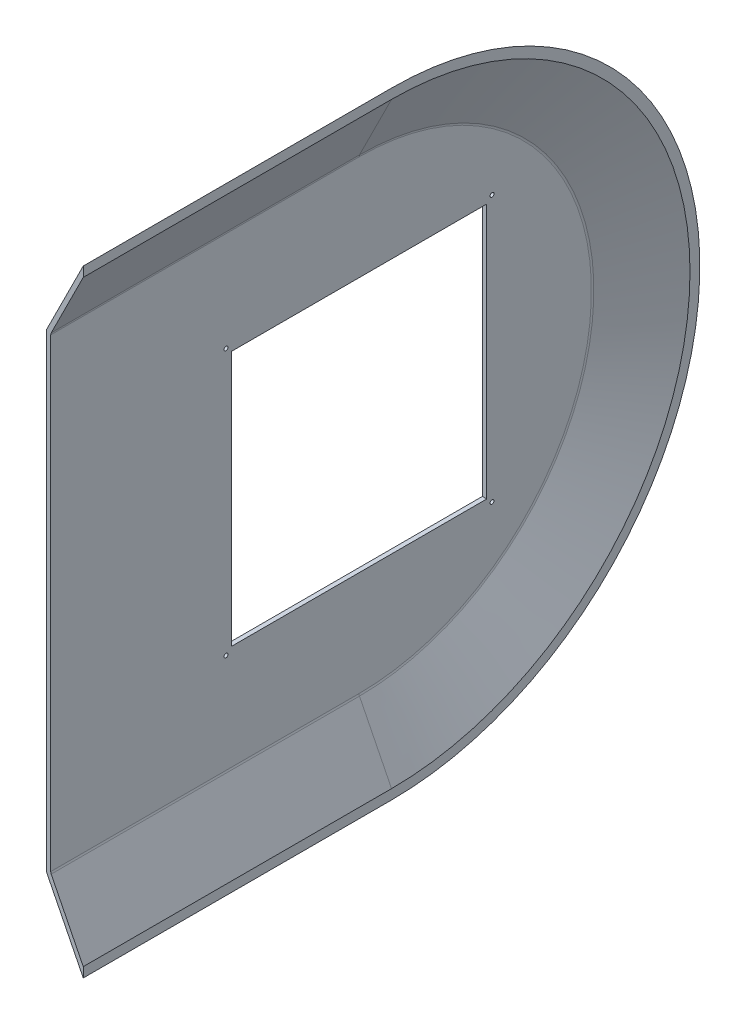
ISO-10303-21;
HEADER;
FILE_DESCRIPTION(('STEP AP214'),'2;1');
FILE_NAME('part.step','',(''),(''),'','','');
FILE_SCHEMA(('AUTOMOTIVE_DESIGN { 1 0 10303 214 1 1 1 1 }'));
ENDSEC;
DATA;
#1=APPLICATION_CONTEXT('core data for automotive mechanical design processes');
#2=APPLICATION_PROTOCOL_DEFINITION('international standard','automotive_design',2000,#1);
#3=PRODUCT_CONTEXT('',#1,'mechanical');
#4=PRODUCT('Part','Part','',(#3));
#5=PRODUCT_RELATED_PRODUCT_CATEGORY('part','',(#4));
#6=PRODUCT_DEFINITION_FORMATION('','',#4);
#7=PRODUCT_DEFINITION_CONTEXT('part definition',#1,'design');
#8=PRODUCT_DEFINITION('design','',#6,#7);
#9=PRODUCT_DEFINITION_SHAPE('','',#8);
#10=(LENGTH_UNIT() NAMED_UNIT(*) SI_UNIT(.MILLI.,.METRE.));
#11=(NAMED_UNIT(*) PLANE_ANGLE_UNIT() SI_UNIT($,.RADIAN.));
#12=(NAMED_UNIT(*) SI_UNIT($,.STERADIAN.) SOLID_ANGLE_UNIT());
#13=UNCERTAINTY_MEASURE_WITH_UNIT(LENGTH_MEASURE(1.E-05),#10,'distance_accuracy_value','');
#14=(GEOMETRIC_REPRESENTATION_CONTEXT(3) GLOBAL_UNCERTAINTY_ASSIGNED_CONTEXT((#13)) GLOBAL_UNIT_ASSIGNED_CONTEXT((#10,
#11,#12)) REPRESENTATION_CONTEXT('',''));
#15=CARTESIAN_POINT('',(0.,0.,0.));
#16=DIRECTION('',(0.,0.,1.));
#17=DIRECTION('',(1.,0.,0.));
#18=AXIS2_PLACEMENT_3D('',#15,#16,#17);
#19=CARTESIAN_POINT('',(41.9267587966222,-350.,2.44403693719019E-12));
#20=DIRECTION('',(1.,0.,0.));
#21=DIRECTION('',(0.,0.,-1.));
#22=AXIS2_PLACEMENT_3D('',#19,#20,#21);
#23=PLANE('',#22);
#24=DIRECTION('',(0.,1.,0.));
#25=VECTOR('',#24,1.);
#26=CARTESIAN_POINT('',(41.9267587966222,-350.,350.));
#27=LINE('',#26,#25);
#28=CARTESIAN_POINT('',(41.9267587966222,338.824360039982,350.));
#29=VERTEX_POINT('',#28);
#30=CARTESIAN_POINT('',(41.9267587966222,350.,350.));
#31=VERTEX_POINT('',#30);
#32=EDGE_CURVE('E241',#29,#31,#27,.T.);
#33=ORIENTED_EDGE('',*,*,#32,.F.);
#34=DIRECTION('',(0.,0.,-1.));
#35=VECTOR('',#34,1.);
#36=CARTESIAN_POINT('',(41.9267587966222,338.824360039982,350.));
#37=LINE('',#36,#35);
#38=CARTESIAN_POINT('',(41.9267587966222,338.824360039982,1.11022302462516E-13));
#39=VERTEX_POINT('',#38);
#40=EDGE_CURVE('E224',#29,#39,#37,.T.);
#41=ORIENTED_EDGE('',*,*,#40,.T.);
#42=CARTESIAN_POINT('',(41.9267587966222,0.,0.));
#43=DIRECTION('',(1.,0.,0.));
#44=DIRECTION('',(0.,0.,-1.));
#45=AXIS2_PLACEMENT_3D('',#42,#43,#44);
#46=CIRCLE('',#45,338.824360039982);
#47=CARTESIAN_POINT('',(41.9267587966222,-338.824360039982,2.46973290244916E-12));
#48=VERTEX_POINT('',#47);
#49=EDGE_CURVE('E220',#48,#39,#46,.T.);
#50=ORIENTED_EDGE('',*,*,#49,.F.);
#51=DIRECTION('',(0.,0.,-1.));
#52=VECTOR('',#51,1.);
#53=CARTESIAN_POINT('',(41.9267587966222,-338.824360039982,350.));
#54=LINE('',#53,#52);
#55=CARTESIAN_POINT('',(41.9267587966222,-338.824360039982,350.));
#56=VERTEX_POINT('',#55);
#57=EDGE_CURVE('E216',#56,#48,#54,.T.);
#58=ORIENTED_EDGE('',*,*,#57,.F.);
#59=CARTESIAN_POINT('',(41.9267587966222,-350.,350.));
#60=VERTEX_POINT('',#59);
#61=EDGE_CURVE('E242',#60,#56,#27,.T.);
#62=ORIENTED_EDGE('',*,*,#61,.F.);
#63=DIRECTION('',(0.,0.,-1.));
#64=VECTOR('',#63,1.);
#65=CARTESIAN_POINT('',(41.9267587966222,-350.,350.));
#66=LINE('',#65,#64);
#67=CARTESIAN_POINT('',(41.9267587966222,-350.,2.44403693719019E-12));
#68=VERTEX_POINT('',#67);
#69=EDGE_CURVE('E254',#60,#68,#66,.T.);
#70=ORIENTED_EDGE('',*,*,#69,.T.);
#71=CARTESIAN_POINT('',(41.9267587966222,0.,0.));
#72=DIRECTION('',(1.,0.,0.));
#73=DIRECTION('',(0.,0.,-1.));
#74=AXIS2_PLACEMENT_3D('',#71,#72,#73);
#75=CIRCLE('',#74,350.);
#76=CARTESIAN_POINT('',(41.9267587966222,350.,0.));
#77=VERTEX_POINT('',#76);
#78=EDGE_CURVE('E265',#68,#77,#75,.T.);
#79=ORIENTED_EDGE('',*,*,#78,.T.);
#80=DIRECTION('',(0.,0.,-1.));
#81=VECTOR('',#80,1.);
#82=CARTESIAN_POINT('',(41.9267587966222,350.,350.));
#83=LINE('',#82,#81);
#84=EDGE_CURVE('E253',#31,#77,#83,.T.);
#85=ORIENTED_EDGE('',*,*,#84,.F.);
#86=EDGE_LOOP('',(#33,#41,#50,#58,#62,#70,#79,#85));
#87=FACE_BOUND('',#86,.T.);
#88=ADVANCED_FACE('F50',(#87),#23,.T.);
#89=CARTESIAN_POINT('',(41.9267587966222,0.,0.));
#90=DIRECTION('',(1.,0.,0.));
#91=DIRECTION('',(0.,0.,-1.));
#92=AXIS2_PLACEMENT_3D('',#89,#90,#91);
#93=CONICAL_SURFACE('',#92,350.,1.10693843119627);
#94=DIRECTION('',(-0.447401671661572,0.894333128199124,0.));
#95=VECTOR('',#94,1.);
#96=CARTESIAN_POINT('',(-1.02719614803289E-12,-266.190547052319,1.85879865521924E-12));
#97=LINE('',#96,#95);
#98=CARTESIAN_POINT('',(0.528334359003852,-267.24666049568,1.86617345597763E-12));
#99=VERTEX_POINT('',#98);
#100=EDGE_CURVE('E262',#68,#99,#97,.T.);
#101=ORIENTED_EDGE('',*,*,#100,.T.);
#102=CARTESIAN_POINT('',(0.528334359003846,0.,0.));
#103=DIRECTION('',(-1.,0.,0.));
#104=DIRECTION('',(0.,0.,1.));
#105=AXIS2_PLACEMENT_3D('',#102,#103,#104);
#106=CIRCLE('',#105,267.24666049568);
#107=CARTESIAN_POINT('',(0.528334359003851,267.24666049568,0.));
#108=VERTEX_POINT('',#107);
#109=EDGE_CURVE('E68',#99,#108,#106,.F.);
#110=ORIENTED_EDGE('',*,*,#109,.T.);
#111=DIRECTION('',(-0.447401671661572,-0.894333128199124,0.));
#112=VECTOR('',#111,1.);
#113=CARTESIAN_POINT('',(-1.02719614803289E-12,266.190547052319,0.));
#114=LINE('',#113,#112);
#115=EDGE_CURVE('E257',#77,#108,#114,.T.);
#116=ORIENTED_EDGE('',*,*,#115,.F.);
#117=ORIENTED_EDGE('',*,*,#78,.F.);
#118=EDGE_LOOP('',(#101,#110,#116,#117));
#119=FACE_BOUND('',#118,.T.);
#120=ADVANCED_FACE('F455',(#119),#93,.T.);
#121=CARTESIAN_POINT('',(-5.13598074016445E-13,-266.190547052319,1.85879865521924E-12));
#122=DIRECTION('',(-1.,0.,0.));
#123=DIRECTION('',(0.,0.,1.));
#124=AXIS2_PLACEMENT_3D('',#121,#122,#123);
#125=PLANE('',#124);
#126=CARTESIAN_POINT('',(0.,151.,151.));
#127=DIRECTION('',(-1.,0.,0.));
#128=DIRECTION('',(0.,0.,1.));
#129=AXIS2_PLACEMENT_3D('',#126,#127,#128);
#130=CIRCLE('',#129,2.25);
#131=CARTESIAN_POINT('',(0.,151.,153.25));
#132=VERTEX_POINT('',#131);
#133=EDGE_CURVE('E298',#132,#132,#130,.T.);
#134=ORIENTED_EDGE('',*,*,#133,.F.);
#135=EDGE_LOOP('',(#134));
#136=FACE_BOUND('',#135,.T.);
#137=CARTESIAN_POINT('',(0.,-151.,151.));
#138=DIRECTION('',(-1.,0.,0.));
#139=DIRECTION('',(0.,0.,1.));
#140=AXIS2_PLACEMENT_3D('',#137,#138,#139);
#141=CIRCLE('',#140,2.25);
#142=CARTESIAN_POINT('',(0.,-151.,153.25));
#143=VERTEX_POINT('',#142);
#144=EDGE_CURVE('E293',#143,#143,#141,.T.);
#145=ORIENTED_EDGE('',*,*,#144,.F.);
#146=EDGE_LOOP('',(#145));
#147=FACE_BOUND('',#146,.T.);
#148=CARTESIAN_POINT('',(0.,-151.,-151.));
#149=DIRECTION('',(-1.,0.,0.));
#150=DIRECTION('',(0.,0.,1.));
#151=AXIS2_PLACEMENT_3D('',#148,#149,#150);
#152=CIRCLE('',#151,2.25);
#153=CARTESIAN_POINT('',(0.,-151.,-148.75));
#154=VERTEX_POINT('',#153);
#155=EDGE_CURVE('E288',#154,#154,#152,.T.);
#156=ORIENTED_EDGE('',*,*,#155,.F.);
#157=EDGE_LOOP('',(#156));
#158=FACE_BOUND('',#157,.T.);
#159=CARTESIAN_POINT('',(0.,151.,-151.));
#160=DIRECTION('',(-1.,0.,0.));
#161=DIRECTION('',(0.,0.,1.));
#162=AXIS2_PLACEMENT_3D('',#159,#160,#161);
#163=CIRCLE('',#162,2.25);
#164=CARTESIAN_POINT('',(0.,151.,-148.75));
#165=VERTEX_POINT('',#164);
#166=EDGE_CURVE('E287',#165,#165,#163,.T.);
#167=ORIENTED_EDGE('',*,*,#166,.F.);
#168=EDGE_LOOP('',(#167));
#169=FACE_BOUND('',#168,.T.);
#170=DIRECTION('',(0.,-1.,0.));
#171=VECTOR('',#170,1.);
#172=CARTESIAN_POINT('',(0.,145.,-145.));
#173=LINE('',#172,#171);
#174=CARTESIAN_POINT('',(0.,145.,-145.));
#175=VERTEX_POINT('',#174);
#176=CARTESIAN_POINT('',(-5.13598074016445E-13,-145.,-145.));
#177=VERTEX_POINT('',#176);
#178=EDGE_CURVE('E190',#175,#177,#173,.T.);
#179=ORIENTED_EDGE('',*,*,#178,.F.);
#180=DIRECTION('',(0.,0.,-1.));
#181=VECTOR('',#180,1.);
#182=CARTESIAN_POINT('',(0.,145.,-145.));
#183=LINE('',#182,#181);
#184=CARTESIAN_POINT('',(0.,145.,145.));
#185=VERTEX_POINT('',#184);
#186=EDGE_CURVE('E195',#185,#175,#183,.T.);
#187=ORIENTED_EDGE('',*,*,#186,.F.);
#188=DIRECTION('',(0.,1.,0.));
#189=VECTOR('',#188,1.);
#190=CARTESIAN_POINT('',(0.,145.,145.));
#191=LINE('',#190,#189);
#192=CARTESIAN_POINT('',(0.,-145.,145.));
#193=VERTEX_POINT('',#192);
#194=EDGE_CURVE('E172',#193,#185,#191,.T.);
#195=ORIENTED_EDGE('',*,*,#194,.F.);
#196=DIRECTION('',(0.,0.,1.));
#197=VECTOR('',#196,1.);
#198=CARTESIAN_POINT('',(0.,-145.,-145.));
#199=LINE('',#198,#197);
#200=EDGE_CURVE('E184',#177,#193,#199,.T.);
#201=ORIENTED_EDGE('',*,*,#200,.F.);
#202=EDGE_LOOP('',(#179,#187,#195,#201));
#203=FACE_BOUND('',#202,.T.);
#204=CARTESIAN_POINT('',(-5.13478148889135E-13,0.,0.));
#205=DIRECTION('',(-1.,0.,0.));
#206=DIRECTION('',(0.,0.,1.));
#207=AXIS2_PLACEMENT_3D('',#204,#205,#206);
#208=CIRCLE('',#207,265.009652137372);
#209=CARTESIAN_POINT('',(-5.13598074016445E-13,265.009652137372,0.));
#210=VERTEX_POINT('',#209);
#211=CARTESIAN_POINT('',(-5.13598074016445E-13,-265.009652137372,1.86617345597763E-12));
#212=VERTEX_POINT('',#211);
#213=EDGE_CURVE('E324',#210,#212,#208,.T.);
#214=ORIENTED_EDGE('',*,*,#213,.T.);
#215=DIRECTION('',(0.,0.,-1.));
#216=VECTOR('',#215,1.);
#217=CARTESIAN_POINT('',(-5.13598074016445E-13,-265.009652137372,350.));
#218=LINE('',#217,#216);
#219=CARTESIAN_POINT('',(-1.02488690202372E-12,-265.009652137372,350.));
#220=VERTEX_POINT('',#219);
#221=EDGE_CURVE('E327',#212,#220,#218,.F.);
#222=ORIENTED_EDGE('',*,*,#221,.T.);
#223=DIRECTION('',(0.,-1.,0.));
#224=VECTOR('',#223,1.);
#225=CARTESIAN_POINT('',(0.,266.190547052322,350.));
#226=LINE('',#225,#224);
#227=CARTESIAN_POINT('',(0.,265.009652137372,350.));
#228=VERTEX_POINT('',#227);
#229=EDGE_CURVE('E249',#228,#220,#226,.T.);
#230=ORIENTED_EDGE('',*,*,#229,.F.);
#231=DIRECTION('',(0.,0.,-1.));
#232=VECTOR('',#231,1.);
#233=CARTESIAN_POINT('',(-5.13598074016445E-13,265.009652137372,1.85879865521924E-12));
#234=LINE('',#233,#232);
#235=EDGE_CURVE('E321',#228,#210,#234,.T.);
#236=ORIENTED_EDGE('',*,*,#235,.T.);
#237=EDGE_LOOP('',(#214,#222,#230,#236));
#238=FACE_BOUND('',#237,.T.);
#239=ADVANCED_FACE('F192',(#136,#147,#158,#169,#203,#238),#125,.T.);
#240=CARTESIAN_POINT('',(0.,266.190547052322,350.));
#241=DIRECTION('',(-0.894333128199124,0.447401671661572,0.));
#242=DIRECTION('',(-0.447401671661572,-0.894333128199124,0.));
#243=AXIS2_PLACEMENT_3D('',#240,#241,#242);
#244=PLANE('',#243);
#245=ORIENTED_EDGE('',*,*,#115,.T.);
#246=DIRECTION('',(0.,0.,-1.));
#247=VECTOR('',#246,1.);
#248=CARTESIAN_POINT('',(0.528334359003841,267.24666049568,350.));
#249=LINE('',#248,#247);
#250=CARTESIAN_POINT('',(0.52833435900384,267.24666049568,350.));
#251=VERTEX_POINT('',#250);
#252=EDGE_CURVE('E75',#108,#251,#249,.F.);
#253=ORIENTED_EDGE('',*,*,#252,.T.);
#254=DIRECTION('',(0.447401671661572,0.894333128199124,0.));
#255=VECTOR('',#254,1.);
#256=CARTESIAN_POINT('',(0.,266.190547052322,350.));
#257=LINE('',#256,#255);
#258=EDGE_CURVE('E223',#251,#31,#257,.T.);
#259=ORIENTED_EDGE('',*,*,#258,.T.);
#260=ORIENTED_EDGE('',*,*,#84,.T.);
#261=EDGE_LOOP('',(#245,#253,#259,#260));
#262=FACE_BOUND('',#261,.T.);
#263=ADVANCED_FACE('F454',(#262),#244,.T.);
#264=CARTESIAN_POINT('',(-1.02719614803289E-12,-266.190547052319,350.));
#265=DIRECTION('',(0.894333128199124,0.447401671661572,0.));
#266=DIRECTION('',(-0.447401671661572,0.894333128199124,0.));
#267=AXIS2_PLACEMENT_3D('',#264,#265,#266);
#268=PLANE('',#267);
#269=DIRECTION('',(0.447401671661572,-0.894333128199124,0.));
#270=VECTOR('',#269,1.);
#271=CARTESIAN_POINT('',(-1.02719614803289E-12,-266.190547052319,350.));
#272=LINE('',#271,#270);
#273=CARTESIAN_POINT('',(0.528334359003854,-267.24666049568,350.));
#274=VERTEX_POINT('',#273);
#275=EDGE_CURVE('E246',#274,#60,#272,.T.);
#276=ORIENTED_EDGE('',*,*,#275,.F.);
#277=DIRECTION('',(0.,0.,-1.));
#278=VECTOR('',#277,1.);
#279=CARTESIAN_POINT('',(0.528334359003854,-267.24666049568,1.11022302462516E-13));
#280=LINE('',#279,#278);
#281=EDGE_CURVE('E317',#274,#99,#280,.T.);
#282=ORIENTED_EDGE('',*,*,#281,.T.);
#283=ORIENTED_EDGE('',*,*,#100,.F.);
#284=ORIENTED_EDGE('',*,*,#69,.F.);
#285=EDGE_LOOP('',(#276,#282,#283,#284));
#286=FACE_BOUND('',#285,.T.);
#287=ADVANCED_FACE('F374',(#286),#268,.F.);
#288=CARTESIAN_POINT('',(0.,0.,350.));
#289=DIRECTION('',(0.,0.,-1.));
#290=DIRECTION('',(-1.,0.,0.));
#291=AXIS2_PLACEMENT_3D('',#288,#289,#290);
#292=PLANE('',#291);
#293=ORIENTED_EDGE('',*,*,#229,.T.);
#294=CARTESIAN_POINT('',(4.99999999999949,-265.009652137372,350.));
#295=DIRECTION('',(0.,0.,-1.));
#296=DIRECTION('',(-1.,0.,0.));
#297=AXIS2_PLACEMENT_3D('',#294,#295,#296);
#298=CIRCLE('',#297,5.);
#299=EDGE_CURVE('E333',#220,#274,#298,.F.);
#300=ORIENTED_EDGE('',*,*,#299,.T.);
#301=ORIENTED_EDGE('',*,*,#275,.T.);
#302=ORIENTED_EDGE('',*,*,#61,.T.);
#303=DIRECTION('',(0.447401671661572,-0.894333128199124,0.));
#304=VECTOR('',#303,1.);
#305=CARTESIAN_POINT('',(-102.038129544797,-51.0458891570857,350.));
#306=LINE('',#305,#304);
#307=CARTESIAN_POINT('',(5.52833435900385,-266.065765580732,350.));
#308=VERTEX_POINT('',#307);
#309=EDGE_CURVE('E231',#308,#56,#306,.T.);
#310=ORIENTED_EDGE('',*,*,#309,.F.);
#311=CARTESIAN_POINT('',(9.99999999999949,-263.828757222424,350.));
#312=DIRECTION('',(0.,0.,-1.));
#313=DIRECTION('',(-1.,0.,0.));
#314=AXIS2_PLACEMENT_3D('',#311,#312,#313);
#315=CIRCLE('',#314,5.);
#316=CARTESIAN_POINT('',(4.99999999999949,-263.828757222424,350.));
#317=VERTEX_POINT('',#316);
#318=EDGE_CURVE('E60',#308,#317,#315,.T.);
#319=ORIENTED_EDGE('',*,*,#318,.T.);
#320=DIRECTION('',(0.,-1.,0.));
#321=VECTOR('',#320,1.);
#322=CARTESIAN_POINT('',(4.99999999999949,-266.190547052319,350.));
#323=LINE('',#322,#321);
#324=CARTESIAN_POINT('',(4.99999999999949,263.828757222424,350.));
#325=VERTEX_POINT('',#324);
#326=EDGE_CURVE('E228',#325,#317,#323,.T.);
#327=ORIENTED_EDGE('',*,*,#326,.F.);
#328=CARTESIAN_POINT('',(9.99999999999949,263.828757222424,350.));
#329=DIRECTION('',(0.,0.,-1.));
#330=DIRECTION('',(-1.,0.,0.));
#331=AXIS2_PLACEMENT_3D('',#328,#329,#330);
#332=CIRCLE('',#331,5.);
#333=CARTESIAN_POINT('',(5.52833435900385,266.065765580732,350.));
#334=VERTEX_POINT('',#333);
#335=EDGE_CURVE('E12',#325,#334,#332,.T.);
#336=ORIENTED_EDGE('',*,*,#335,.T.);
#337=DIRECTION('',(0.447401671661572,0.894333128199124,0.));
#338=VECTOR('',#337,1.);
#339=CARTESIAN_POINT('',(-102.038129544797,51.0458891570857,350.));
#340=LINE('',#339,#338);
#341=EDGE_CURVE('E206',#334,#29,#340,.T.);
#342=ORIENTED_EDGE('',*,*,#341,.T.);
#343=ORIENTED_EDGE('',*,*,#32,.T.);
#344=ORIENTED_EDGE('',*,*,#258,.F.);
#345=CARTESIAN_POINT('',(4.99999999999949,265.009652137372,350.));
#346=DIRECTION('',(0.,0.,-1.));
#347=DIRECTION('',(-1.,0.,0.));
#348=AXIS2_PLACEMENT_3D('',#345,#346,#347);
#349=CIRCLE('',#348,5.);
#350=EDGE_CURVE('E330',#251,#228,#349,.F.);
#351=ORIENTED_EDGE('',*,*,#350,.T.);
#352=EDGE_LOOP('',(#293,#300,#301,#302,#310,#319,#327,#336,#342,#343,#344,#351));
#353=FACE_BOUND('',#352,.T.);
#354=ADVANCED_FACE('F367',(#353),#292,.F.);
#355=CARTESIAN_POINT('',(46.3984244376178,0.,0.));
#356=DIRECTION('',(1.,0.,0.));
#357=DIRECTION('',(0.,0.,-1.));
#358=AXIS2_PLACEMENT_3D('',#355,#356,#357);
#359=CONICAL_SURFACE('',#358,347.762991641692,1.10693843119627);
#360=DIRECTION('',(-0.447401671661572,-0.894333128199124,0.));
#361=VECTOR('',#360,1.);
#362=CARTESIAN_POINT('',(4.47166564099563,263.953538694014,1.11022302462516E-13));
#363=LINE('',#362,#361);
#364=CARTESIAN_POINT('',(5.52833435900387,266.065765580732,1.11022302462516E-13));
#365=VERTEX_POINT('',#364);
#366=EDGE_CURVE('E211',#39,#365,#363,.T.);
#367=ORIENTED_EDGE('',*,*,#366,.T.);
#368=CARTESIAN_POINT('',(5.52833435900391,0.,0.));
#369=DIRECTION('',(1.,0.,0.));
#370=DIRECTION('',(0.,0.,-1.));
#371=AXIS2_PLACEMENT_3D('',#368,#369,#370);
#372=CIRCLE('',#371,266.065765580732);
#373=CARTESIAN_POINT('',(5.52833435900388,-266.065765580732,1.93938645790556E-12));
#374=VERTEX_POINT('',#373);
#375=EDGE_CURVE('E311',#365,#374,#372,.F.);
#376=ORIENTED_EDGE('',*,*,#375,.T.);
#377=DIRECTION('',(0.447401671661572,-0.894333128199124,0.));
#378=VECTOR('',#377,1.);
#379=CARTESIAN_POINT('',(46.3984244376178,-347.762991641692,2.53488769995843E-12));
#380=LINE('',#379,#378);
#381=EDGE_CURVE('E215',#48,#374,#380,.F.);
#382=ORIENTED_EDGE('',*,*,#381,.F.);
#383=ORIENTED_EDGE('',*,*,#49,.T.);
#384=EDGE_LOOP('',(#367,#376,#382,#383));
#385=FACE_BOUND('',#384,.T.);
#386=ADVANCED_FACE('F407',(#385),#359,.F.);
#387=CARTESIAN_POINT('',(4.99999999999949,-266.190547052319,1.85879865521924E-12));
#388=DIRECTION('',(-1.,0.,0.));
#389=DIRECTION('',(0.,0.,1.));
#390=AXIS2_PLACEMENT_3D('',#387,#388,#389);
#391=PLANE('',#390);
#392=CARTESIAN_POINT('',(4.99999999999949,151.,151.));
#393=DIRECTION('',(-1.,0.,0.));
#394=DIRECTION('',(0.,0.,1.));
#395=AXIS2_PLACEMENT_3D('',#392,#393,#394);
#396=CIRCLE('',#395,2.24999999999999);
#397=CARTESIAN_POINT('',(4.99999999999949,151.,153.25));
#398=VERTEX_POINT('',#397);
#399=EDGE_CURVE('E294',#398,#398,#396,.T.);
#400=ORIENTED_EDGE('',*,*,#399,.T.);
#401=EDGE_LOOP('',(#400));
#402=FACE_BOUND('',#401,.T.);
#403=CARTESIAN_POINT('',(4.99999999999949,-151.,151.));
#404=DIRECTION('',(-1.,0.,0.));
#405=DIRECTION('',(0.,0.,1.));
#406=AXIS2_PLACEMENT_3D('',#403,#404,#405);
#407=CIRCLE('',#406,2.24999999999999);
#408=CARTESIAN_POINT('',(4.99999999999949,-151.,153.25));
#409=VERTEX_POINT('',#408);
#410=EDGE_CURVE('E289',#409,#409,#407,.T.);
#411=ORIENTED_EDGE('',*,*,#410,.T.);
#412=EDGE_LOOP('',(#411));
#413=FACE_BOUND('',#412,.T.);
#414=CARTESIAN_POINT('',(4.99999999999949,-151.,-151.));
#415=DIRECTION('',(-1.,0.,0.));
#416=DIRECTION('',(0.,0.,1.));
#417=AXIS2_PLACEMENT_3D('',#414,#415,#416);
#418=CIRCLE('',#417,2.24999999999999);
#419=CARTESIAN_POINT('',(4.99999999999949,-151.,-148.75));
#420=VERTEX_POINT('',#419);
#421=EDGE_CURVE('E283',#420,#420,#418,.T.);
#422=ORIENTED_EDGE('',*,*,#421,.T.);
#423=EDGE_LOOP('',(#422));
#424=FACE_BOUND('',#423,.T.);
#425=CARTESIAN_POINT('',(4.99999999999949,151.,-151.));
#426=DIRECTION('',(-1.,0.,0.));
#427=DIRECTION('',(0.,0.,1.));
#428=AXIS2_PLACEMENT_3D('',#425,#426,#427);
#429=CIRCLE('',#428,2.24999999999999);
#430=CARTESIAN_POINT('',(4.99999999999949,151.,-148.75));
#431=VERTEX_POINT('',#430);
#432=EDGE_CURVE('E682',#431,#431,#429,.T.);
#433=ORIENTED_EDGE('',*,*,#432,.T.);
#434=EDGE_LOOP('',(#433));
#435=FACE_BOUND('',#434,.T.);
#436=DIRECTION('',(0.,0.,-1.));
#437=VECTOR('',#436,1.);
#438=CARTESIAN_POINT('',(4.99999999999949,145.,1.85879865521924E-12));
#439=LINE('',#438,#437);
#440=CARTESIAN_POINT('',(4.99999999999948,145.,145.));
#441=VERTEX_POINT('',#440);
#442=CARTESIAN_POINT('',(4.99999999999948,145.,-145.));
#443=VERTEX_POINT('',#442);
#444=EDGE_CURVE('E274',#441,#443,#439,.T.);
#445=ORIENTED_EDGE('',*,*,#444,.T.);
#446=DIRECTION('',(0.,-1.,0.));
#447=VECTOR('',#446,1.);
#448=CARTESIAN_POINT('',(4.99999999999949,-266.190547052319,-145.));
#449=LINE('',#448,#447);
#450=CARTESIAN_POINT('',(4.99999999999948,-145.,-145.));
#451=VERTEX_POINT('',#450);
#452=EDGE_CURVE('E278',#443,#451,#449,.T.);
#453=ORIENTED_EDGE('',*,*,#452,.T.);
#454=DIRECTION('',(0.,0.,1.));
#455=VECTOR('',#454,1.);
#456=CARTESIAN_POINT('',(4.99999999999949,-145.,1.84719964352058E-12));
#457=LINE('',#456,#455);
#458=CARTESIAN_POINT('',(4.99999999999949,-145.,145.));
#459=VERTEX_POINT('',#458);
#460=EDGE_CURVE('E269',#451,#459,#457,.T.);
#461=ORIENTED_EDGE('',*,*,#460,.T.);
#462=DIRECTION('',(0.,1.,0.));
#463=VECTOR('',#462,1.);
#464=CARTESIAN_POINT('',(4.99999999999949,-266.190547052319,145.));
#465=LINE('',#464,#463);
#466=EDGE_CURVE('E175',#459,#441,#465,.T.);
#467=ORIENTED_EDGE('',*,*,#466,.T.);
#468=EDGE_LOOP('',(#445,#453,#461,#467));
#469=FACE_BOUND('',#468,.T.);
#470=ORIENTED_EDGE('',*,*,#326,.T.);
#471=DIRECTION('',(0.,0.,-1.));
#472=VECTOR('',#471,1.);
#473=CARTESIAN_POINT('',(4.99999999999949,-263.828757222424,1.85879865521924E-12));
#474=LINE('',#473,#472);
#475=CARTESIAN_POINT('',(4.99999999999949,-263.828757222424,1.93938645790556E-12));
#476=VERTEX_POINT('',#475);
#477=EDGE_CURVE('E304',#317,#476,#474,.T.);
#478=ORIENTED_EDGE('',*,*,#477,.T.);
#479=CARTESIAN_POINT('',(4.99999999999949,0.,0.));
#480=DIRECTION('',(-1.,0.,0.));
#481=DIRECTION('',(0.,0.,1.));
#482=AXIS2_PLACEMENT_3D('',#479,#480,#481);
#483=CIRCLE('',#482,263.828757222424);
#484=CARTESIAN_POINT('',(4.99999999999949,263.828757222424,1.10088857236952E-13));
#485=VERTEX_POINT('',#484);
#486=EDGE_CURVE('E301',#476,#485,#483,.F.);
#487=ORIENTED_EDGE('',*,*,#486,.T.);
#488=DIRECTION('',(0.,0.,-1.));
#489=VECTOR('',#488,1.);
#490=CARTESIAN_POINT('',(4.99999999999949,263.828757222424,350.));
#491=LINE('',#490,#489);
#492=EDGE_CURVE('E282',#485,#325,#491,.F.);
#493=ORIENTED_EDGE('',*,*,#492,.T.);
#494=EDGE_LOOP('',(#470,#478,#487,#493));
#495=FACE_BOUND('',#494,.T.);
#496=ADVANCED_FACE('F393',(#402,#413,#424,#435,#469,#495),#391,.F.);
#497=CARTESIAN_POINT('',(4.47166564099563,263.953538694014,350.));
#498=DIRECTION('',(-0.894333128199124,0.447401671661572,0.));
#499=DIRECTION('',(-0.447401671661572,-0.894333128199124,0.));
#500=AXIS2_PLACEMENT_3D('',#497,#498,#499);
#501=PLANE('',#500);
#502=ORIENTED_EDGE('',*,*,#341,.F.);
#503=DIRECTION('',(0.,0.,-1.));
#504=VECTOR('',#503,1.);
#505=CARTESIAN_POINT('',(5.52833435900387,266.065765580732,1.11022302462516E-13));
#506=LINE('',#505,#504);
#507=EDGE_CURVE('E314',#334,#365,#506,.T.);
#508=ORIENTED_EDGE('',*,*,#507,.T.);
#509=ORIENTED_EDGE('',*,*,#366,.F.);
#510=ORIENTED_EDGE('',*,*,#40,.F.);
#511=EDGE_LOOP('',(#502,#508,#509,#510));
#512=FACE_BOUND('',#511,.T.);
#513=ADVANCED_FACE('F404',(#512),#501,.F.);
#514=CARTESIAN_POINT('',(4.47166564099459,-263.953538694012,350.));
#515=DIRECTION('',(0.894333128199124,0.447401671661572,0.));
#516=DIRECTION('',(-0.447401671661572,0.894333128199124,0.));
#517=AXIS2_PLACEMENT_3D('',#514,#515,#516);
#518=PLANE('',#517);
#519=ORIENTED_EDGE('',*,*,#381,.T.);
#520=DIRECTION('',(0.,0.,-1.));
#521=VECTOR('',#520,1.);
#522=CARTESIAN_POINT('',(5.52833435900385,-266.065765580732,350.));
#523=LINE('',#522,#521);
#524=EDGE_CURVE('E308',#374,#308,#523,.F.);
#525=ORIENTED_EDGE('',*,*,#524,.T.);
#526=ORIENTED_EDGE('',*,*,#309,.T.);
#527=ORIENTED_EDGE('',*,*,#57,.T.);
#528=EDGE_LOOP('',(#519,#525,#526,#527));
#529=FACE_BOUND('',#528,.T.);
#530=ADVANCED_FACE('F505',(#529),#518,.T.);
#531=CARTESIAN_POINT('',(41.9267587966222,145.,-145.));
#532=DIRECTION('',(0.,0.,-1.));
#533=DIRECTION('',(0.,1.,0.));
#534=AXIS2_PLACEMENT_3D('',#531,#532,#533);
#535=PLANE('',#534);
#536=DIRECTION('',(-1.,0.,0.));
#537=VECTOR('',#536,1.);
#538=CARTESIAN_POINT('',(41.9267587966222,145.,-145.));
#539=LINE('',#538,#537);
#540=EDGE_CURVE('E203',#443,#175,#539,.T.);
#541=ORIENTED_EDGE('',*,*,#540,.T.);
#542=ORIENTED_EDGE('',*,*,#178,.T.);
#543=DIRECTION('',(-1.,0.,0.));
#544=VECTOR('',#543,1.);
#545=CARTESIAN_POINT('',(41.9267587966222,-145.,-145.));
#546=LINE('',#545,#544);
#547=EDGE_CURVE('E180',#451,#177,#546,.T.);
#548=ORIENTED_EDGE('',*,*,#547,.F.);
#549=ORIENTED_EDGE('',*,*,#452,.F.);
#550=EDGE_LOOP('',(#541,#542,#548,#549));
#551=FACE_BOUND('',#550,.T.);
#552=ADVANCED_FACE('F509',(#551),#535,.F.);
#553=CARTESIAN_POINT('',(41.9267587966222,145.,-145.));
#554=DIRECTION('',(0.,1.,0.));
#555=DIRECTION('',(0.,0.,1.));
#556=AXIS2_PLACEMENT_3D('',#553,#554,#555);
#557=PLANE('',#556);
#558=DIRECTION('',(-1.,0.,0.));
#559=VECTOR('',#558,1.);
#560=CARTESIAN_POINT('',(41.9267587966222,145.,145.));
#561=LINE('',#560,#559);
#562=EDGE_CURVE('E179',#441,#185,#561,.T.);
#563=ORIENTED_EDGE('',*,*,#562,.T.);
#564=ORIENTED_EDGE('',*,*,#186,.T.);
#565=ORIENTED_EDGE('',*,*,#540,.F.);
#566=ORIENTED_EDGE('',*,*,#444,.F.);
#567=EDGE_LOOP('',(#563,#564,#565,#566));
#568=FACE_BOUND('',#567,.T.);
#569=ADVANCED_FACE('F589',(#568),#557,.F.);
#570=CARTESIAN_POINT('',(41.9267587966222,145.,145.));
#571=DIRECTION('',(0.,0.,1.));
#572=DIRECTION('',(0.,-1.,0.));
#573=AXIS2_PLACEMENT_3D('',#570,#571,#572);
#574=PLANE('',#573);
#575=DIRECTION('',(-1.,0.,0.));
#576=VECTOR('',#575,1.);
#577=CARTESIAN_POINT('',(41.9267587966222,-145.,145.));
#578=LINE('',#577,#576);
#579=EDGE_CURVE('E167',#459,#193,#578,.T.);
#580=ORIENTED_EDGE('',*,*,#579,.T.);
#581=ORIENTED_EDGE('',*,*,#194,.T.);
#582=ORIENTED_EDGE('',*,*,#562,.F.);
#583=ORIENTED_EDGE('',*,*,#466,.F.);
#584=EDGE_LOOP('',(#580,#581,#582,#583));
#585=FACE_BOUND('',#584,.T.);
#586=ADVANCED_FACE('F169',(#585),#574,.F.);
#587=CARTESIAN_POINT('',(41.9267587966222,-145.,-145.));
#588=DIRECTION('',(0.,-1.,0.));
#589=DIRECTION('',(0.,0.,-1.));
#590=AXIS2_PLACEMENT_3D('',#587,#588,#589);
#591=PLANE('',#590);
#592=ORIENTED_EDGE('',*,*,#547,.T.);
#593=ORIENTED_EDGE('',*,*,#200,.T.);
#594=ORIENTED_EDGE('',*,*,#579,.F.);
#595=ORIENTED_EDGE('',*,*,#460,.F.);
#596=EDGE_LOOP('',(#592,#593,#594,#595));
#597=FACE_BOUND('',#596,.T.);
#598=ADVANCED_FACE('F185',(#597),#591,.F.);
#599=CARTESIAN_POINT('',(0.,151.,-151.));
#600=DIRECTION('',(-1.,0.,0.));
#601=DIRECTION('',(0.,0.,1.));
#602=AXIS2_PLACEMENT_3D('',#599,#600,#601);
#603=CYLINDRICAL_SURFACE('',#602,2.24999999999999);
#604=ORIENTED_EDGE('',*,*,#166,.T.);
#605=EDGE_LOOP('',(#604));
#606=FACE_BOUND('',#605,.T.);
#607=ORIENTED_EDGE('',*,*,#432,.F.);
#608=EDGE_LOOP('',(#607));
#609=FACE_BOUND('',#608,.T.);
#610=ADVANCED_FACE('F613',(#606,#609),#603,.F.);
#611=CARTESIAN_POINT('',(0.,-151.,-151.));
#612=DIRECTION('',(-1.,0.,0.));
#613=DIRECTION('',(0.,0.,1.));
#614=AXIS2_PLACEMENT_3D('',#611,#612,#613);
#615=CYLINDRICAL_SURFACE('',#614,2.24999999999999);
#616=ORIENTED_EDGE('',*,*,#155,.T.);
#617=EDGE_LOOP('',(#616));
#618=FACE_BOUND('',#617,.T.);
#619=ORIENTED_EDGE('',*,*,#421,.F.);
#620=EDGE_LOOP('',(#619));
#621=FACE_BOUND('',#620,.T.);
#622=ADVANCED_FACE('F621',(#618,#621),#615,.F.);
#623=CARTESIAN_POINT('',(0.,-151.,151.));
#624=DIRECTION('',(-1.,0.,0.));
#625=DIRECTION('',(0.,0.,1.));
#626=AXIS2_PLACEMENT_3D('',#623,#624,#625);
#627=CYLINDRICAL_SURFACE('',#626,2.24999999999999);
#628=ORIENTED_EDGE('',*,*,#144,.T.);
#629=EDGE_LOOP('',(#628));
#630=FACE_BOUND('',#629,.T.);
#631=ORIENTED_EDGE('',*,*,#410,.F.);
#632=EDGE_LOOP('',(#631));
#633=FACE_BOUND('',#632,.T.);
#634=ADVANCED_FACE('F630',(#630,#633),#627,.F.);
#635=CARTESIAN_POINT('',(0.,151.,151.));
#636=DIRECTION('',(-1.,0.,0.));
#637=DIRECTION('',(0.,0.,1.));
#638=AXIS2_PLACEMENT_3D('',#635,#636,#637);
#639=CYLINDRICAL_SURFACE('',#638,2.24999999999999);
#640=ORIENTED_EDGE('',*,*,#133,.T.);
#641=EDGE_LOOP('',(#640));
#642=FACE_BOUND('',#641,.T.);
#643=ORIENTED_EDGE('',*,*,#399,.F.);
#644=EDGE_LOOP('',(#643));
#645=FACE_BOUND('',#644,.T.);
#646=ADVANCED_FACE('F477',(#642,#645),#639,.F.);
#647=CARTESIAN_POINT('',(9.99999999999949,263.828757222424,350.));
#648=DIRECTION('',(0.,0.,1.));
#649=DIRECTION('',(1.,0.,0.));
#650=AXIS2_PLACEMENT_3D('',#647,#648,#649);
#651=CYLINDRICAL_SURFACE('',#650,5.);
#652=ORIENTED_EDGE('',*,*,#335,.F.);
#653=ORIENTED_EDGE('',*,*,#492,.F.);
#654=CARTESIAN_POINT('',(9.99999999999949,263.828757222424,1.11022302462516E-13));
#655=DIRECTION('',(0.,0.,1.));
#656=DIRECTION('',(0.,-1.,0.));
#657=AXIS2_PLACEMENT_3D('',#654,#655,#656);
#658=CIRCLE('',#657,5.);
#659=EDGE_CURVE('E345',#365,#485,#658,.T.);
#660=ORIENTED_EDGE('',*,*,#659,.F.);
#661=ORIENTED_EDGE('',*,*,#507,.F.);
#662=EDGE_LOOP('',(#652,#653,#660,#661));
#663=FACE_BOUND('',#662,.T.);
#664=ADVANCED_FACE('F399',(#663),#651,.F.);
#665=CARTESIAN_POINT('',(9.99999999999949,0.,0.));
#666=DIRECTION('',(-1.,0.,0.));
#667=DIRECTION('',(0.,0.,1.));
#668=AXIS2_PLACEMENT_3D('',#665,#666,#667);
#669=TOROIDAL_SURFACE('',#668,263.828757222424,5.);
#670=ORIENTED_EDGE('',*,*,#659,.T.);
#671=ORIENTED_EDGE('',*,*,#486,.F.);
#672=CARTESIAN_POINT('',(9.99999999999949,-263.828757222424,1.92308062574841E-12));
#673=DIRECTION('',(0.,0.,-1.));
#674=DIRECTION('',(-1.,0.,0.));
#675=AXIS2_PLACEMENT_3D('',#672,#673,#674);
#676=CIRCLE('',#675,5.);
#677=EDGE_CURVE('E342',#374,#476,#676,.T.);
#678=ORIENTED_EDGE('',*,*,#677,.F.);
#679=ORIENTED_EDGE('',*,*,#375,.F.);
#680=EDGE_LOOP('',(#670,#671,#678,#679));
#681=FACE_BOUND('',#680,.T.);
#682=ADVANCED_FACE('F471',(#681),#669,.F.);
#683=CARTESIAN_POINT('',(9.99999999999949,-263.828757222424,1.85879865521924E-12));
#684=DIRECTION('',(0.,0.,-1.));
#685=DIRECTION('',(-1.,0.,0.));
#686=AXIS2_PLACEMENT_3D('',#683,#684,#685);
#687=CYLINDRICAL_SURFACE('',#686,5.);
#688=ORIENTED_EDGE('',*,*,#318,.F.);
#689=ORIENTED_EDGE('',*,*,#524,.F.);
#690=ORIENTED_EDGE('',*,*,#677,.T.);
#691=ORIENTED_EDGE('',*,*,#477,.F.);
#692=EDGE_LOOP('',(#688,#689,#690,#691));
#693=FACE_BOUND('',#692,.T.);
#694=ADVANCED_FACE('F389',(#693),#687,.F.);
#695=CARTESIAN_POINT('',(4.99999999999949,265.009652137372,1.85879865521924E-12));
#696=DIRECTION('',(0.,0.,-1.));
#697=DIRECTION('',(-1.,0.,0.));
#698=AXIS2_PLACEMENT_3D('',#695,#696,#697);
#699=CYLINDRICAL_SURFACE('',#698,5.);
#700=ORIENTED_EDGE('',*,*,#350,.F.);
#701=ORIENTED_EDGE('',*,*,#252,.F.);
#702=CARTESIAN_POINT('',(4.99999999999949,265.009652137372,0.));
#703=DIRECTION('',(0.,0.,-1.));
#704=DIRECTION('',(-1.,0.,0.));
#705=AXIS2_PLACEMENT_3D('',#702,#703,#704);
#706=CIRCLE('',#705,5.);
#707=EDGE_CURVE('E54',#210,#108,#706,.T.);
#708=ORIENTED_EDGE('',*,*,#707,.F.);
#709=ORIENTED_EDGE('',*,*,#235,.F.);
#710=EDGE_LOOP('',(#700,#701,#708,#709));
#711=FACE_BOUND('',#710,.T.);
#712=ADVANCED_FACE('F52',(#711),#699,.T.);
#713=CARTESIAN_POINT('',(4.99999999999948,0.,0.));
#714=DIRECTION('',(-1.,0.,0.));
#715=DIRECTION('',(0.,0.,1.));
#716=AXIS2_PLACEMENT_3D('',#713,#714,#715);
#717=TOROIDAL_SURFACE('',#716,265.009652137372,5.);
#718=ORIENTED_EDGE('',*,*,#707,.T.);
#719=ORIENTED_EDGE('',*,*,#109,.F.);
#720=CARTESIAN_POINT('',(4.99999999999949,-265.009652137372,1.86617345597763E-12));
#721=DIRECTION('',(0.,0.,1.));
#722=DIRECTION('',(1.,0.,0.));
#723=AXIS2_PLACEMENT_3D('',#720,#721,#722);
#724=CIRCLE('',#723,5.);
#725=EDGE_CURVE('E348',#212,#99,#724,.T.);
#726=ORIENTED_EDGE('',*,*,#725,.F.);
#727=ORIENTED_EDGE('',*,*,#213,.F.);
#728=EDGE_LOOP('',(#718,#719,#726,#727));
#729=FACE_BOUND('',#728,.T.);
#730=ADVANCED_FACE('F361',(#729),#717,.T.);
#731=CARTESIAN_POINT('',(4.99999999999949,-265.009652137372,350.));
#732=DIRECTION('',(0.,0.,1.));
#733=DIRECTION('',(1.,0.,0.));
#734=AXIS2_PLACEMENT_3D('',#731,#732,#733);
#735=CYLINDRICAL_SURFACE('',#734,5.);
#736=ORIENTED_EDGE('',*,*,#299,.F.);
#737=ORIENTED_EDGE('',*,*,#221,.F.);
#738=ORIENTED_EDGE('',*,*,#725,.T.);
#739=ORIENTED_EDGE('',*,*,#281,.F.);
#740=EDGE_LOOP('',(#736,#737,#738,#739));
#741=FACE_BOUND('',#740,.T.);
#742=ADVANCED_FACE('F370',(#741),#735,.T.);
#743=CLOSED_SHELL('',(#88,#120,#239,#263,#287,#354,#386,#496,#513,#530,#552,#569,#586,#598,#610,
#622,#634,#646,#664,#682,#694,#712,#730,#742));
#744=MANIFOLD_SOLID_BREP('B2',#743);
#745=ADVANCED_BREP_SHAPE_REPRESENTATION('',(#18,#744),#14);
#746=SHAPE_DEFINITION_REPRESENTATION(#9,#745);
ENDSEC;
END-ISO-10303-21;
